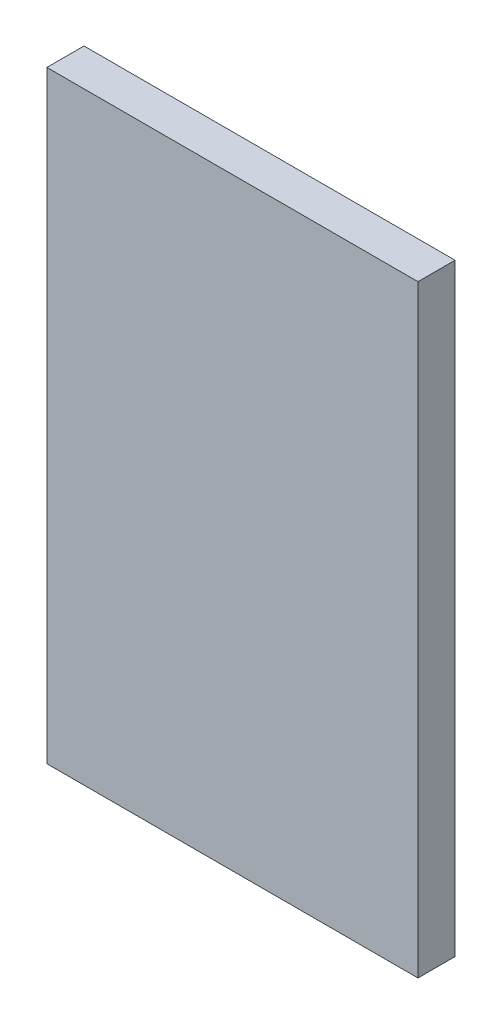
ISO-10303-21;
HEADER;
FILE_DESCRIPTION(('STEP AP214'),'2;1');
FILE_NAME('part.step','',(''),(''),'','','');
FILE_SCHEMA(('AUTOMOTIVE_DESIGN { 1 0 10303 214 1 1 1 1 }'));
ENDSEC;
DATA;
#1=APPLICATION_CONTEXT('core data for automotive mechanical design processes');
#2=APPLICATION_PROTOCOL_DEFINITION('international standard','automotive_design',2000,#1);
#3=PRODUCT_CONTEXT('',#1,'mechanical');
#4=PRODUCT('Part','Part','',(#3));
#5=PRODUCT_RELATED_PRODUCT_CATEGORY('part','',(#4));
#6=PRODUCT_DEFINITION_FORMATION('','',#4);
#7=PRODUCT_DEFINITION_CONTEXT('part definition',#1,'design');
#8=PRODUCT_DEFINITION('design','',#6,#7);
#9=PRODUCT_DEFINITION_SHAPE('','',#8);
#10=(LENGTH_UNIT() NAMED_UNIT(*) SI_UNIT(.MILLI.,.METRE.));
#11=(NAMED_UNIT(*) PLANE_ANGLE_UNIT() SI_UNIT($,.RADIAN.));
#12=(NAMED_UNIT(*) SI_UNIT($,.STERADIAN.) SOLID_ANGLE_UNIT());
#13=UNCERTAINTY_MEASURE_WITH_UNIT(LENGTH_MEASURE(1.E-05),#10,'distance_accuracy_value','');
#14=(GEOMETRIC_REPRESENTATION_CONTEXT(3) GLOBAL_UNCERTAINTY_ASSIGNED_CONTEXT((#13)) GLOBAL_UNIT_ASSIGNED_CONTEXT((#10,
#11,#12)) REPRESENTATION_CONTEXT('',''));
#15=CARTESIAN_POINT('',(0.,0.,0.));
#16=DIRECTION('',(0.,0.,1.));
#17=DIRECTION('',(1.,0.,0.));
#18=AXIS2_PLACEMENT_3D('',#15,#16,#17);
#19=CARTESIAN_POINT('',(0.,0.,4.));
#20=DIRECTION('',(1.,0.,0.));
#21=DIRECTION('',(0.,1.,0.));
#22=AXIS2_PLACEMENT_3D('',#19,#20,#21);
#23=PLANE('',#22);
#24=DIRECTION('',(0.,-1.,0.));
#25=VECTOR('',#24,1.);
#26=CARTESIAN_POINT('',(0.,0.,0.));
#27=LINE('',#26,#25);
#28=CARTESIAN_POINT('',(0.,65.,0.));
#29=VERTEX_POINT('',#28);
#30=CARTESIAN_POINT('',(0.,0.,0.));
#31=VERTEX_POINT('',#30);
#32=EDGE_CURVE('E113',#29,#31,#27,.T.);
#33=ORIENTED_EDGE('',*,*,#32,.T.);
#34=DIRECTION('',(0.,0.,-1.));
#35=VECTOR('',#34,1.);
#36=CARTESIAN_POINT('',(0.,0.,4.));
#37=LINE('',#36,#35);
#38=CARTESIAN_POINT('',(0.,0.,4.));
#39=VERTEX_POINT('',#38);
#40=EDGE_CURVE('E11',#39,#31,#37,.T.);
#41=ORIENTED_EDGE('',*,*,#40,.F.);
#42=DIRECTION('',(0.,-1.,0.));
#43=VECTOR('',#42,1.);
#44=CARTESIAN_POINT('',(0.,0.,4.));
#45=LINE('',#44,#43);
#46=CARTESIAN_POINT('',(0.,65.,4.));
#47=VERTEX_POINT('',#46);
#48=EDGE_CURVE('E97',#47,#39,#45,.T.);
#49=ORIENTED_EDGE('',*,*,#48,.F.);
#50=DIRECTION('',(0.,0.,-1.));
#51=VECTOR('',#50,1.);
#52=CARTESIAN_POINT('',(0.,65.,4.));
#53=LINE('',#52,#51);
#54=EDGE_CURVE('E109',#47,#29,#53,.T.);
#55=ORIENTED_EDGE('',*,*,#54,.T.);
#56=EDGE_LOOP('',(#33,#41,#49,#55));
#57=FACE_BOUND('',#56,.T.);
#58=ADVANCED_FACE('F45',(#57),#23,.F.);
#59=CARTESIAN_POINT('',(0.,0.,4.));
#60=DIRECTION('',(0.,1.,0.));
#61=DIRECTION('',(0.,0.,1.));
#62=AXIS2_PLACEMENT_3D('',#59,#60,#61);
#63=PLANE('',#62);
#64=DIRECTION('',(1.,0.,0.));
#65=VECTOR('',#64,1.);
#66=CARTESIAN_POINT('',(0.,0.,0.));
#67=LINE('',#66,#65);
#68=CARTESIAN_POINT('',(40.,0.,0.));
#69=VERTEX_POINT('',#68);
#70=EDGE_CURVE('E102',#31,#69,#67,.T.);
#71=ORIENTED_EDGE('',*,*,#70,.T.);
#72=DIRECTION('',(0.,0.,-1.));
#73=VECTOR('',#72,1.);
#74=CARTESIAN_POINT('',(40.,0.,4.));
#75=LINE('',#74,#73);
#76=CARTESIAN_POINT('',(40.,0.,4.));
#77=VERTEX_POINT('',#76);
#78=EDGE_CURVE('E54',#77,#69,#75,.T.);
#79=ORIENTED_EDGE('',*,*,#78,.F.);
#80=DIRECTION('',(1.,0.,0.));
#81=VECTOR('',#80,1.);
#82=CARTESIAN_POINT('',(0.,0.,4.));
#83=LINE('',#82,#81);
#84=EDGE_CURVE('E92',#39,#77,#83,.T.);
#85=ORIENTED_EDGE('',*,*,#84,.F.);
#86=ORIENTED_EDGE('',*,*,#40,.T.);
#87=EDGE_LOOP('',(#71,#79,#85,#86));
#88=FACE_BOUND('',#87,.T.);
#89=ADVANCED_FACE('F101',(#88),#63,.F.);
#90=CARTESIAN_POINT('',(40.,0.,4.));
#91=DIRECTION('',(-1.,0.,0.));
#92=DIRECTION('',(0.,-1.,0.));
#93=AXIS2_PLACEMENT_3D('',#90,#91,#92);
#94=PLANE('',#93);
#95=DIRECTION('',(0.,1.,0.));
#96=VECTOR('',#95,1.);
#97=CARTESIAN_POINT('',(40.,0.,0.));
#98=LINE('',#97,#96);
#99=CARTESIAN_POINT('',(40.,65.,0.));
#100=VERTEX_POINT('',#99);
#101=EDGE_CURVE('E79',#69,#100,#98,.T.);
#102=ORIENTED_EDGE('',*,*,#101,.T.);
#103=DIRECTION('',(0.,0.,-1.));
#104=VECTOR('',#103,1.);
#105=CARTESIAN_POINT('',(40.,65.,4.));
#106=LINE('',#105,#104);
#107=CARTESIAN_POINT('',(40.,65.,4.));
#108=VERTEX_POINT('',#107);
#109=EDGE_CURVE('E104',#108,#100,#106,.T.);
#110=ORIENTED_EDGE('',*,*,#109,.F.);
#111=DIRECTION('',(0.,1.,0.));
#112=VECTOR('',#111,1.);
#113=CARTESIAN_POINT('',(40.,0.,4.));
#114=LINE('',#113,#112);
#115=EDGE_CURVE('E95',#77,#108,#114,.T.);
#116=ORIENTED_EDGE('',*,*,#115,.F.);
#117=ORIENTED_EDGE('',*,*,#78,.T.);
#118=EDGE_LOOP('',(#102,#110,#116,#117));
#119=FACE_BOUND('',#118,.T.);
#120=ADVANCED_FACE('F105',(#119),#94,.F.);
#121=CARTESIAN_POINT('',(0.,65.,4.));
#122=DIRECTION('',(0.,-1.,0.));
#123=DIRECTION('',(0.,0.,-1.));
#124=AXIS2_PLACEMENT_3D('',#121,#122,#123);
#125=PLANE('',#124);
#126=DIRECTION('',(-1.,0.,0.));
#127=VECTOR('',#126,1.);
#128=CARTESIAN_POINT('',(0.,65.,0.));
#129=LINE('',#128,#127);
#130=EDGE_CURVE('E85',#100,#29,#129,.T.);
#131=ORIENTED_EDGE('',*,*,#130,.T.);
#132=ORIENTED_EDGE('',*,*,#54,.F.);
#133=DIRECTION('',(-1.,0.,0.));
#134=VECTOR('',#133,1.);
#135=CARTESIAN_POINT('',(0.,65.,4.));
#136=LINE('',#135,#134);
#137=EDGE_CURVE('E62',#108,#47,#136,.T.);
#138=ORIENTED_EDGE('',*,*,#137,.F.);
#139=ORIENTED_EDGE('',*,*,#109,.T.);
#140=EDGE_LOOP('',(#131,#132,#138,#139));
#141=FACE_BOUND('',#140,.T.);
#142=ADVANCED_FACE('F126',(#141),#125,.F.);
#143=CARTESIAN_POINT('',(0.,0.,4.));
#144=DIRECTION('',(0.,0.,-1.));
#145=DIRECTION('',(-1.,0.,0.));
#146=AXIS2_PLACEMENT_3D('',#143,#144,#145);
#147=PLANE('',#146);
#148=ORIENTED_EDGE('',*,*,#48,.T.);
#149=ORIENTED_EDGE('',*,*,#84,.T.);
#150=ORIENTED_EDGE('',*,*,#115,.T.);
#151=ORIENTED_EDGE('',*,*,#137,.T.);
#152=EDGE_LOOP('',(#148,#149,#150,#151));
#153=FACE_BOUND('',#152,.T.);
#154=ADVANCED_FACE('F93',(#153),#147,.F.);
#155=CARTESIAN_POINT('',(0.,0.,0.));
#156=DIRECTION('',(0.,0.,-1.));
#157=DIRECTION('',(-1.,0.,0.));
#158=AXIS2_PLACEMENT_3D('',#155,#156,#157);
#159=PLANE('',#158);
#160=ORIENTED_EDGE('',*,*,#32,.F.);
#161=ORIENTED_EDGE('',*,*,#130,.F.);
#162=ORIENTED_EDGE('',*,*,#101,.F.);
#163=ORIENTED_EDGE('',*,*,#70,.F.);
#164=EDGE_LOOP('',(#160,#161,#162,#163));
#165=FACE_BOUND('',#164,.T.);
#166=ADVANCED_FACE('F129',(#165),#159,.T.);
#167=CLOSED_SHELL('',(#58,#89,#120,#142,#154,#166));
#168=MANIFOLD_SOLID_BREP('B2',#167);
#169=ADVANCED_BREP_SHAPE_REPRESENTATION('',(#18,#168),#14);
#170=SHAPE_DEFINITION_REPRESENTATION(#9,#169);
ENDSEC;
END-ISO-10303-21;
